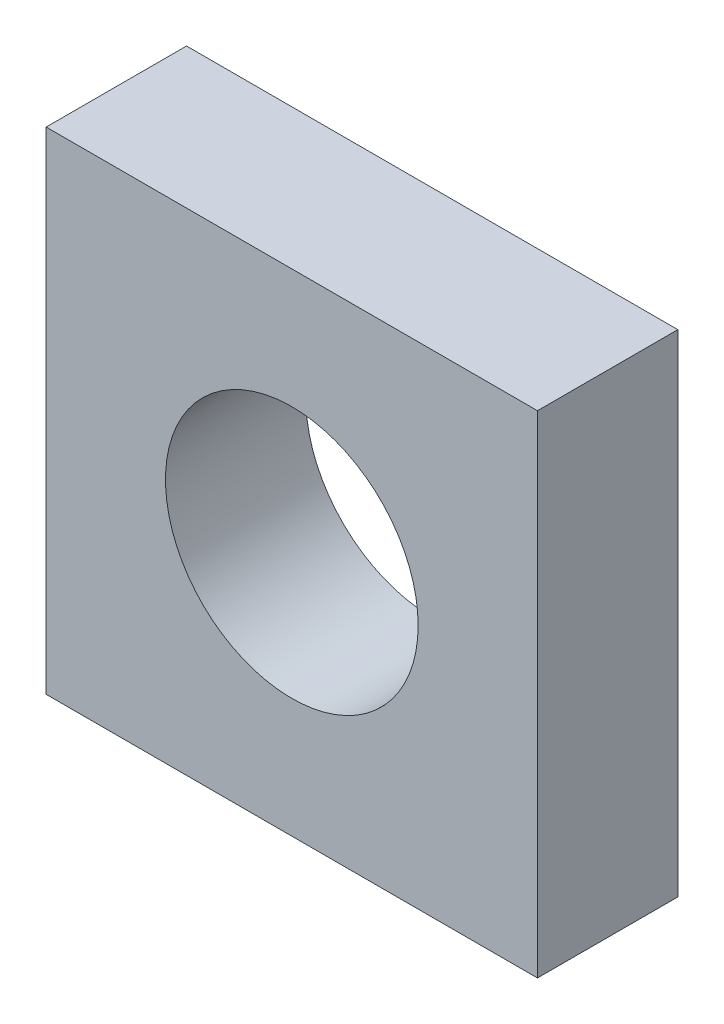
ISO-10303-21;
HEADER;
FILE_DESCRIPTION(('STEP AP214'),'2;1');
FILE_NAME('part.step','',(''),(''),'','','');
FILE_SCHEMA(('AUTOMOTIVE_DESIGN { 1 0 10303 214 1 1 1 1 }'));
ENDSEC;
DATA;
#1=APPLICATION_CONTEXT('core data for automotive mechanical design processes');
#2=APPLICATION_PROTOCOL_DEFINITION('international standard','automotive_design',2000,#1);
#3=PRODUCT_CONTEXT('',#1,'mechanical');
#4=PRODUCT('Part','Part','',(#3));
#5=PRODUCT_RELATED_PRODUCT_CATEGORY('part','',(#4));
#6=PRODUCT_DEFINITION_FORMATION('','',#4);
#7=PRODUCT_DEFINITION_CONTEXT('part definition',#1,'design');
#8=PRODUCT_DEFINITION('design','',#6,#7);
#9=PRODUCT_DEFINITION_SHAPE('','',#8);
#10=(LENGTH_UNIT() NAMED_UNIT(*) SI_UNIT(.MILLI.,.METRE.));
#11=(NAMED_UNIT(*) PLANE_ANGLE_UNIT() SI_UNIT($,.RADIAN.));
#12=(NAMED_UNIT(*) SI_UNIT($,.STERADIAN.) SOLID_ANGLE_UNIT());
#13=UNCERTAINTY_MEASURE_WITH_UNIT(LENGTH_MEASURE(1.E-05),#10,'distance_accuracy_value','');
#14=(GEOMETRIC_REPRESENTATION_CONTEXT(3) GLOBAL_UNCERTAINTY_ASSIGNED_CONTEXT((#13)) GLOBAL_UNIT_ASSIGNED_CONTEXT((#10,
#11,#12)) REPRESENTATION_CONTEXT('',''));
#15=CARTESIAN_POINT('',(0.,0.,0.));
#16=DIRECTION('',(0.,0.,1.));
#17=DIRECTION('',(1.,0.,0.));
#18=AXIS2_PLACEMENT_3D('',#15,#16,#17);
#19=CARTESIAN_POINT('',(0.,0.,20.));
#20=DIRECTION('',(0.,0.,-1.));
#21=DIRECTION('',(-1.,0.,0.));
#22=AXIS2_PLACEMENT_3D('',#19,#20,#21);
#23=PLANE('',#22);
#24=DIRECTION('',(0.,1.,0.));
#25=VECTOR('',#24,1.);
#26=CARTESIAN_POINT('',(35.,-35.,20.));
#27=LINE('',#26,#25);
#28=CARTESIAN_POINT('',(35.,-35.,20.));
#29=VERTEX_POINT('',#28);
#30=CARTESIAN_POINT('',(35.,35.,20.));
#31=VERTEX_POINT('',#30);
#32=EDGE_CURVE('E92',#29,#31,#27,.T.);
#33=ORIENTED_EDGE('',*,*,#32,.T.);
#34=DIRECTION('',(-1.,0.,0.));
#35=VECTOR('',#34,1.);
#36=CARTESIAN_POINT('',(-35.,35.,20.));
#37=LINE('',#36,#35);
#38=CARTESIAN_POINT('',(-35.,35.,20.));
#39=VERTEX_POINT('',#38);
#40=EDGE_CURVE('E87',#31,#39,#37,.T.);
#41=ORIENTED_EDGE('',*,*,#40,.T.);
#42=DIRECTION('',(0.,-1.,0.));
#43=VECTOR('',#42,1.);
#44=CARTESIAN_POINT('',(-35.,-35.,20.));
#45=LINE('',#44,#43);
#46=CARTESIAN_POINT('',(-35.,-35.,20.));
#47=VERTEX_POINT('',#46);
#48=EDGE_CURVE('E90',#39,#47,#45,.T.);
#49=ORIENTED_EDGE('',*,*,#48,.T.);
#50=DIRECTION('',(1.,0.,0.));
#51=VECTOR('',#50,1.);
#52=CARTESIAN_POINT('',(-35.,-35.,20.));
#53=LINE('',#52,#51);
#54=EDGE_CURVE('E57',#47,#29,#53,.T.);
#55=ORIENTED_EDGE('',*,*,#54,.T.);
#56=EDGE_LOOP('',(#33,#41,#49,#55));
#57=FACE_BOUND('',#56,.T.);
#58=CARTESIAN_POINT('',(0.,0.,20.));
#59=DIRECTION('',(0.,0.,1.));
#60=DIRECTION('',(1.,0.,0.));
#61=AXIS2_PLACEMENT_3D('',#58,#59,#60);
#62=CIRCLE('',#61,18.);
#63=CARTESIAN_POINT('',(18.,0.,20.));
#64=VERTEX_POINT('',#63);
#65=EDGE_CURVE('E112',#64,#64,#62,.T.);
#66=ORIENTED_EDGE('',*,*,#65,.F.);
#67=EDGE_LOOP('',(#66));
#68=FACE_BOUND('',#67,.T.);
#69=ADVANCED_FACE('F39',(#57,#68),#23,.F.);
#70=CARTESIAN_POINT('',(0.,0.,0.));
#71=DIRECTION('',(0.,0.,-1.));
#72=DIRECTION('',(-1.,0.,0.));
#73=AXIS2_PLACEMENT_3D('',#70,#71,#72);
#74=PLANE('',#73);
#75=DIRECTION('',(0.,1.,0.));
#76=VECTOR('',#75,1.);
#77=CARTESIAN_POINT('',(35.,-35.,0.));
#78=LINE('',#77,#76);
#79=CARTESIAN_POINT('',(35.,-35.,0.));
#80=VERTEX_POINT('',#79);
#81=CARTESIAN_POINT('',(35.,35.,0.));
#82=VERTEX_POINT('',#81);
#83=EDGE_CURVE('E108',#80,#82,#78,.T.);
#84=ORIENTED_EDGE('',*,*,#83,.F.);
#85=DIRECTION('',(1.,0.,0.));
#86=VECTOR('',#85,1.);
#87=CARTESIAN_POINT('',(-35.,-35.,0.));
#88=LINE('',#87,#86);
#89=CARTESIAN_POINT('',(-35.,-35.,0.));
#90=VERTEX_POINT('',#89);
#91=EDGE_CURVE('E80',#90,#80,#88,.T.);
#92=ORIENTED_EDGE('',*,*,#91,.F.);
#93=DIRECTION('',(0.,-1.,0.));
#94=VECTOR('',#93,1.);
#95=CARTESIAN_POINT('',(-35.,-35.,0.));
#96=LINE('',#95,#94);
#97=CARTESIAN_POINT('',(-35.,35.,0.));
#98=VERTEX_POINT('',#97);
#99=EDGE_CURVE('E74',#98,#90,#96,.T.);
#100=ORIENTED_EDGE('',*,*,#99,.F.);
#101=DIRECTION('',(-1.,0.,0.));
#102=VECTOR('',#101,1.);
#103=CARTESIAN_POINT('',(-35.,35.,0.));
#104=LINE('',#103,#102);
#105=EDGE_CURVE('E97',#82,#98,#104,.T.);
#106=ORIENTED_EDGE('',*,*,#105,.F.);
#107=EDGE_LOOP('',(#84,#92,#100,#106));
#108=FACE_BOUND('',#107,.T.);
#109=CARTESIAN_POINT('',(0.,0.,0.));
#110=DIRECTION('',(0.,0.,1.));
#111=DIRECTION('',(1.,0.,0.));
#112=AXIS2_PLACEMENT_3D('',#109,#110,#111);
#113=CIRCLE('',#112,18.);
#114=CARTESIAN_POINT('',(18.,0.,0.));
#115=VERTEX_POINT('',#114);
#116=EDGE_CURVE('E130',#115,#115,#113,.T.);
#117=ORIENTED_EDGE('',*,*,#116,.T.);
#118=EDGE_LOOP('',(#117));
#119=FACE_BOUND('',#118,.T.);
#120=ADVANCED_FACE('F125',(#108,#119),#74,.T.);
#121=CARTESIAN_POINT('',(35.,-35.,20.));
#122=DIRECTION('',(-1.,0.,0.));
#123=DIRECTION('',(0.,0.,1.));
#124=AXIS2_PLACEMENT_3D('',#121,#122,#123);
#125=PLANE('',#124);
#126=ORIENTED_EDGE('',*,*,#83,.T.);
#127=DIRECTION('',(0.,0.,-1.));
#128=VECTOR('',#127,1.);
#129=CARTESIAN_POINT('',(35.,35.,20.));
#130=LINE('',#129,#128);
#131=EDGE_CURVE('E11',#31,#82,#130,.T.);
#132=ORIENTED_EDGE('',*,*,#131,.F.);
#133=ORIENTED_EDGE('',*,*,#32,.F.);
#134=DIRECTION('',(0.,0.,-1.));
#135=VECTOR('',#134,1.);
#136=CARTESIAN_POINT('',(35.,-35.,20.));
#137=LINE('',#136,#135);
#138=EDGE_CURVE('E104',#29,#80,#137,.T.);
#139=ORIENTED_EDGE('',*,*,#138,.T.);
#140=EDGE_LOOP('',(#126,#132,#133,#139));
#141=FACE_BOUND('',#140,.T.);
#142=ADVANCED_FACE('F41',(#141),#125,.F.);
#143=CARTESIAN_POINT('',(-35.,35.,20.));
#144=DIRECTION('',(0.,-1.,0.));
#145=DIRECTION('',(0.,0.,-1.));
#146=AXIS2_PLACEMENT_3D('',#143,#144,#145);
#147=PLANE('',#146);
#148=ORIENTED_EDGE('',*,*,#105,.T.);
#149=DIRECTION('',(0.,0.,-1.));
#150=VECTOR('',#149,1.);
#151=CARTESIAN_POINT('',(-35.,35.,20.));
#152=LINE('',#151,#150);
#153=EDGE_CURVE('E49',#39,#98,#152,.T.);
#154=ORIENTED_EDGE('',*,*,#153,.F.);
#155=ORIENTED_EDGE('',*,*,#40,.F.);
#156=ORIENTED_EDGE('',*,*,#131,.T.);
#157=EDGE_LOOP('',(#148,#154,#155,#156));
#158=FACE_BOUND('',#157,.T.);
#159=ADVANCED_FACE('F96',(#158),#147,.F.);
#160=CARTESIAN_POINT('',(-35.,-35.,20.));
#161=DIRECTION('',(1.,0.,0.));
#162=DIRECTION('',(0.,0.,-1.));
#163=AXIS2_PLACEMENT_3D('',#160,#161,#162);
#164=PLANE('',#163);
#165=ORIENTED_EDGE('',*,*,#99,.T.);
#166=DIRECTION('',(0.,0.,-1.));
#167=VECTOR('',#166,1.);
#168=CARTESIAN_POINT('',(-35.,-35.,20.));
#169=LINE('',#168,#167);
#170=EDGE_CURVE('E99',#47,#90,#169,.T.);
#171=ORIENTED_EDGE('',*,*,#170,.F.);
#172=ORIENTED_EDGE('',*,*,#48,.F.);
#173=ORIENTED_EDGE('',*,*,#153,.T.);
#174=EDGE_LOOP('',(#165,#171,#172,#173));
#175=FACE_BOUND('',#174,.T.);
#176=ADVANCED_FACE('F100',(#175),#164,.F.);
#177=CARTESIAN_POINT('',(-35.,-35.,20.));
#178=DIRECTION('',(0.,1.,0.));
#179=DIRECTION('',(0.,0.,1.));
#180=AXIS2_PLACEMENT_3D('',#177,#178,#179);
#181=PLANE('',#180);
#182=ORIENTED_EDGE('',*,*,#91,.T.);
#183=ORIENTED_EDGE('',*,*,#138,.F.);
#184=ORIENTED_EDGE('',*,*,#54,.F.);
#185=ORIENTED_EDGE('',*,*,#170,.T.);
#186=EDGE_LOOP('',(#182,#183,#184,#185));
#187=FACE_BOUND('',#186,.T.);
#188=ADVANCED_FACE('F122',(#187),#181,.F.);
#189=CARTESIAN_POINT('',(0.,0.,20.));
#190=DIRECTION('',(0.,0.,-1.));
#191=DIRECTION('',(-1.,0.,0.));
#192=AXIS2_PLACEMENT_3D('',#189,#190,#191);
#193=CYLINDRICAL_SURFACE('',#192,18.);
#194=ORIENTED_EDGE('',*,*,#65,.T.);
#195=EDGE_LOOP('',(#194));
#196=FACE_BOUND('',#195,.T.);
#197=ORIENTED_EDGE('',*,*,#116,.F.);
#198=EDGE_LOOP('',(#197));
#199=FACE_BOUND('',#198,.T.);
#200=ADVANCED_FACE('F138',(#196,#199),#193,.F.);
#201=CLOSED_SHELL('',(#69,#120,#142,#159,#176,#188,#200));
#202=MANIFOLD_SOLID_BREP('B2',#201);
#203=ADVANCED_BREP_SHAPE_REPRESENTATION('',(#18,#202),#14);
#204=SHAPE_DEFINITION_REPRESENTATION(#9,#203);
ENDSEC;
END-ISO-10303-21;
